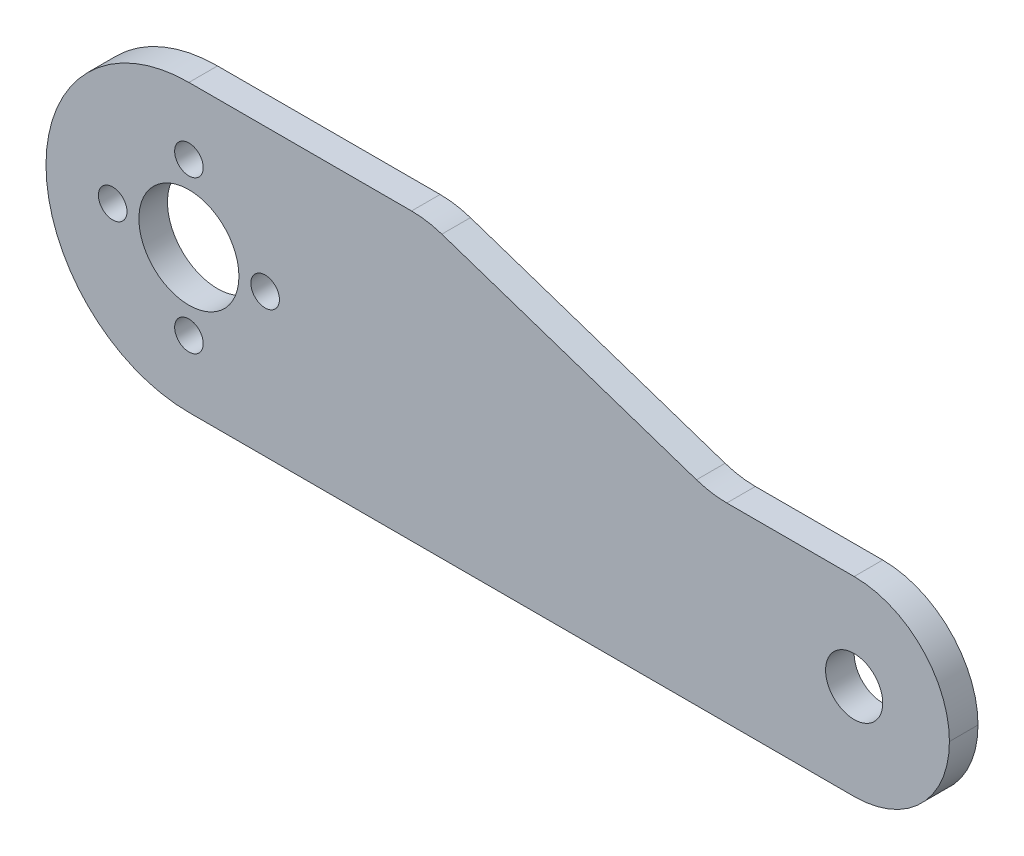
ISO-10303-21;
HEADER;
FILE_DESCRIPTION(('STEP AP214'),'2;1');
FILE_NAME('part.step','',(''),(''),'','','');
FILE_SCHEMA(('AUTOMOTIVE_DESIGN { 1 0 10303 214 1 1 1 1 }'));
ENDSEC;
DATA;
#1=APPLICATION_CONTEXT('core data for automotive mechanical design processes');
#2=APPLICATION_PROTOCOL_DEFINITION('international standard','automotive_design',2000,#1);
#3=PRODUCT_CONTEXT('',#1,'mechanical');
#4=PRODUCT('Part','Part','',(#3));
#5=PRODUCT_RELATED_PRODUCT_CATEGORY('part','',(#4));
#6=PRODUCT_DEFINITION_FORMATION('','',#4);
#7=PRODUCT_DEFINITION_CONTEXT('part definition',#1,'design');
#8=PRODUCT_DEFINITION('design','',#6,#7);
#9=PRODUCT_DEFINITION_SHAPE('','',#8);
#10=(LENGTH_UNIT() NAMED_UNIT(*) SI_UNIT(.MILLI.,.METRE.));
#11=(NAMED_UNIT(*) PLANE_ANGLE_UNIT() SI_UNIT($,.RADIAN.));
#12=(NAMED_UNIT(*) SI_UNIT($,.STERADIAN.) SOLID_ANGLE_UNIT());
#13=UNCERTAINTY_MEASURE_WITH_UNIT(LENGTH_MEASURE(1.E-05),#10,'distance_accuracy_value','');
#14=(GEOMETRIC_REPRESENTATION_CONTEXT(3) GLOBAL_UNCERTAINTY_ASSIGNED_CONTEXT((#13)) GLOBAL_UNIT_ASSIGNED_CONTEXT((#10,
#11,#12)) REPRESENTATION_CONTEXT('',''));
#15=CARTESIAN_POINT('',(0.,0.,0.));
#16=DIRECTION('',(0.,0.,1.));
#17=DIRECTION('',(1.,0.,0.));
#18=AXIS2_PLACEMENT_3D('',#15,#16,#17);
#19=CARTESIAN_POINT('',(0.,0.,3.));
#20=DIRECTION('',(0.,0.,-1.));
#21=DIRECTION('',(-1.,0.,0.));
#22=AXIS2_PLACEMENT_3D('',#19,#20,#21);
#23=PLANE('',#22);
#24=CARTESIAN_POINT('',(15.,15.,3.));
#25=DIRECTION('',(0.,0.,-1.));
#26=DIRECTION('',(-1.,0.,0.));
#27=AXIS2_PLACEMENT_3D('',#24,#25,#26);
#28=CIRCLE('',#27,15.);
#29=CARTESIAN_POINT('',(15.,30.,3.));
#30=VERTEX_POINT('',#29);
#31=CARTESIAN_POINT('',(0.,15.,3.));
#32=VERTEX_POINT('',#31);
#33=EDGE_CURVE('E51',#30,#32,#28,.F.);
#34=ORIENTED_EDGE('',*,*,#33,.T.);
#35=CARTESIAN_POINT('',(15.,15.,3.));
#36=DIRECTION('',(0.,0.,-1.));
#37=DIRECTION('',(-1.,0.,0.));
#38=AXIS2_PLACEMENT_3D('',#35,#36,#37);
#39=CIRCLE('',#38,15.);
#40=CARTESIAN_POINT('',(15.,0.,3.));
#41=VERTEX_POINT('',#40);
#42=EDGE_CURVE('E44',#32,#41,#39,.F.);
#43=ORIENTED_EDGE('',*,*,#42,.T.);
#44=DIRECTION('',(1.,0.,0.));
#45=VECTOR('',#44,1.);
#46=CARTESIAN_POINT('',(0.,0.,3.));
#47=LINE('',#46,#45);
#48=CARTESIAN_POINT('',(84.8212002188447,0.,3.));
#49=VERTEX_POINT('',#48);
#50=EDGE_CURVE('E153',#41,#49,#47,.T.);
#51=ORIENTED_EDGE('',*,*,#50,.T.);
#52=CARTESIAN_POINT('',(84.8212002188447,10.,3.));
#53=DIRECTION('',(0.,0.,-1.));
#54=DIRECTION('',(-1.,0.,0.));
#55=AXIS2_PLACEMENT_3D('',#52,#53,#54);
#56=CIRCLE('',#55,10.);
#57=CARTESIAN_POINT('',(94.8212002188447,10.,3.));
#58=VERTEX_POINT('',#57);
#59=EDGE_CURVE('E158',#49,#58,#56,.F.);
#60=ORIENTED_EDGE('',*,*,#59,.T.);
#61=CARTESIAN_POINT('',(84.8212002188447,10.,3.));
#62=DIRECTION('',(0.,0.,-1.));
#63=DIRECTION('',(-1.,0.,0.));
#64=AXIS2_PLACEMENT_3D('',#61,#62,#63);
#65=CIRCLE('',#64,10.);
#66=CARTESIAN_POINT('',(84.8212002188447,20.,3.));
#67=VERTEX_POINT('',#66);
#68=EDGE_CURVE('E160',#58,#67,#65,.F.);
#69=ORIENTED_EDGE('',*,*,#68,.T.);
#70=DIRECTION('',(-1.,0.,0.));
#71=VECTOR('',#70,1.);
#72=CARTESIAN_POINT('',(94.8212002188447,20.,3.));
#73=LINE('',#72,#71);
#74=CARTESIAN_POINT('',(71.4532030561662,20.,3.));
#75=VERTEX_POINT('',#74);
#76=EDGE_CURVE('E134',#67,#75,#73,.T.);
#77=ORIENTED_EDGE('',*,*,#76,.T.);
#78=CARTESIAN_POINT('',(71.4532030561662,30.,3.));
#79=DIRECTION('',(0.,0.,-1.));
#80=DIRECTION('',(-1.,0.,0.));
#81=AXIS2_PLACEMENT_3D('',#78,#79,#80);
#82=CIRCLE('',#81,10.);
#83=CARTESIAN_POINT('',(68.2738766193188,20.5188669765706,3.));
#84=VERTEX_POINT('',#83);
#85=EDGE_CURVE('E176',#75,#84,#82,.T.);
#86=ORIENTED_EDGE('',*,*,#85,.T.);
#87=DIRECTION('',(-0.948113302342937,0.317932643684744,0.));
#88=VECTOR('',#87,1.);
#89=CARTESIAN_POINT('',(69.8212002188447,20.,3.));
#90=LINE('',#89,#88);
#91=CARTESIAN_POINT('',(41.5473235995259,29.4811330234294,3.));
#92=VERTEX_POINT('',#91);
#93=EDGE_CURVE('E249',#84,#92,#90,.T.);
#94=ORIENTED_EDGE('',*,*,#93,.T.);
#95=CARTESIAN_POINT('',(38.3679971626785,20.,3.));
#96=DIRECTION('',(0.,0.,-1.));
#97=DIRECTION('',(-1.,0.,0.));
#98=AXIS2_PLACEMENT_3D('',#95,#96,#97);
#99=CIRCLE('',#98,10.);
#100=CARTESIAN_POINT('',(38.3679971626785,30.,3.));
#101=VERTEX_POINT('',#100);
#102=EDGE_CURVE('E162',#92,#101,#99,.F.);
#103=ORIENTED_EDGE('',*,*,#102,.T.);
#104=DIRECTION('',(-1.,0.,0.));
#105=VECTOR('',#104,1.);
#106=CARTESIAN_POINT('',(0.,30.,3.));
#107=LINE('',#106,#105);
#108=EDGE_CURVE('E154',#101,#30,#107,.T.);
#109=ORIENTED_EDGE('',*,*,#108,.T.);
#110=EDGE_LOOP('',(#34,#43,#51,#60,#69,#77,#86,#94,#103,#109));
#111=FACE_BOUND('',#110,.T.);
#112=CARTESIAN_POINT('',(15.,15.,3.));
#113=DIRECTION('',(0.,0.,1.));
#114=DIRECTION('',(1.,0.,0.));
#115=AXIS2_PLACEMENT_3D('',#112,#113,#114);
#116=CIRCLE('',#115,5.25);
#117=CARTESIAN_POINT('',(20.25,15.,3.));
#118=VERTEX_POINT('',#117);
#119=EDGE_CURVE('E148',#118,#118,#116,.T.);
#120=ORIENTED_EDGE('',*,*,#119,.F.);
#121=EDGE_LOOP('',(#120));
#122=FACE_BOUND('',#121,.T.);
#123=CARTESIAN_POINT('',(15.,23.,3.));
#124=DIRECTION('',(0.,0.,1.));
#125=DIRECTION('',(1.,0.,0.));
#126=AXIS2_PLACEMENT_3D('',#123,#124,#125);
#127=CIRCLE('',#126,1.5);
#128=CARTESIAN_POINT('',(16.5,23.,3.));
#129=VERTEX_POINT('',#128);
#130=EDGE_CURVE('E258',#129,#129,#127,.T.);
#131=ORIENTED_EDGE('',*,*,#130,.F.);
#132=EDGE_LOOP('',(#131));
#133=FACE_BOUND('',#132,.T.);
#134=CARTESIAN_POINT('',(15.,7.,3.));
#135=DIRECTION('',(0.,0.,1.));
#136=DIRECTION('',(1.,0.,0.));
#137=AXIS2_PLACEMENT_3D('',#134,#135,#136);
#138=CIRCLE('',#137,1.5);
#139=CARTESIAN_POINT('',(16.5,7.,3.));
#140=VERTEX_POINT('',#139);
#141=EDGE_CURVE('E264',#140,#140,#138,.T.);
#142=ORIENTED_EDGE('',*,*,#141,.F.);
#143=EDGE_LOOP('',(#142));
#144=FACE_BOUND('',#143,.T.);
#145=CARTESIAN_POINT('',(23.,15.,3.));
#146=DIRECTION('',(0.,0.,1.));
#147=DIRECTION('',(1.,0.,0.));
#148=AXIS2_PLACEMENT_3D('',#145,#146,#147);
#149=CIRCLE('',#148,1.5);
#150=CARTESIAN_POINT('',(24.5,15.,3.));
#151=VERTEX_POINT('',#150);
#152=EDGE_CURVE('E270',#151,#151,#149,.T.);
#153=ORIENTED_EDGE('',*,*,#152,.F.);
#154=EDGE_LOOP('',(#153));
#155=FACE_BOUND('',#154,.T.);
#156=CARTESIAN_POINT('',(7.,15.,3.));
#157=DIRECTION('',(0.,0.,1.));
#158=DIRECTION('',(1.,0.,0.));
#159=AXIS2_PLACEMENT_3D('',#156,#157,#158);
#160=CIRCLE('',#159,1.5);
#161=CARTESIAN_POINT('',(8.5,15.,3.));
#162=VERTEX_POINT('',#161);
#163=EDGE_CURVE('E276',#162,#162,#160,.T.);
#164=ORIENTED_EDGE('',*,*,#163,.F.);
#165=EDGE_LOOP('',(#164));
#166=FACE_BOUND('',#165,.T.);
#167=CARTESIAN_POINT('',(84.8212002188447,10.,3.));
#168=DIRECTION('',(0.,0.,1.));
#169=DIRECTION('',(1.,0.,0.));
#170=AXIS2_PLACEMENT_3D('',#167,#168,#169);
#171=CIRCLE('',#170,3.00000000000001);
#172=CARTESIAN_POINT('',(87.8212002188447,10.,3.));
#173=VERTEX_POINT('',#172);
#174=EDGE_CURVE('E282',#173,#173,#171,.T.);
#175=ORIENTED_EDGE('',*,*,#174,.F.);
#176=EDGE_LOOP('',(#175));
#177=FACE_BOUND('',#176,.T.);
#178=ADVANCED_FACE('F35',(#111,#122,#133,#144,#155,#166,#177),#23,.F.);
#179=CARTESIAN_POINT('',(0.,0.,0.));
#180=DIRECTION('',(0.,0.,-1.));
#181=DIRECTION('',(-1.,0.,0.));
#182=AXIS2_PLACEMENT_3D('',#179,#180,#181);
#183=PLANE('',#182);
#184=CARTESIAN_POINT('',(7.,15.,0.));
#185=DIRECTION('',(0.,0.,1.));
#186=DIRECTION('',(1.,0.,0.));
#187=AXIS2_PLACEMENT_3D('',#184,#185,#186);
#188=CIRCLE('',#187,1.5);
#189=CARTESIAN_POINT('',(8.5,15.,0.));
#190=VERTEX_POINT('',#189);
#191=EDGE_CURVE('E279',#190,#190,#188,.T.);
#192=ORIENTED_EDGE('',*,*,#191,.T.);
#193=EDGE_LOOP('',(#192));
#194=FACE_BOUND('',#193,.T.);
#195=CARTESIAN_POINT('',(15.,7.,0.));
#196=DIRECTION('',(0.,0.,1.));
#197=DIRECTION('',(1.,0.,0.));
#198=AXIS2_PLACEMENT_3D('',#195,#196,#197);
#199=CIRCLE('',#198,1.5);
#200=CARTESIAN_POINT('',(16.5,7.,0.));
#201=VERTEX_POINT('',#200);
#202=EDGE_CURVE('E267',#201,#201,#199,.T.);
#203=ORIENTED_EDGE('',*,*,#202,.T.);
#204=EDGE_LOOP('',(#203));
#205=FACE_BOUND('',#204,.T.);
#206=CARTESIAN_POINT('',(15.,15.,0.));
#207=DIRECTION('',(0.,0.,1.));
#208=DIRECTION('',(1.,0.,0.));
#209=AXIS2_PLACEMENT_3D('',#206,#207,#208);
#210=CIRCLE('',#209,5.25);
#211=CARTESIAN_POINT('',(20.25,15.,0.));
#212=VERTEX_POINT('',#211);
#213=EDGE_CURVE('E255',#212,#212,#210,.T.);
#214=ORIENTED_EDGE('',*,*,#213,.T.);
#215=EDGE_LOOP('',(#214));
#216=FACE_BOUND('',#215,.T.);
#217=DIRECTION('',(1.,0.,0.));
#218=VECTOR('',#217,1.);
#219=CARTESIAN_POINT('',(0.,0.,0.));
#220=LINE('',#219,#218);
#221=CARTESIAN_POINT('',(15.,0.,0.));
#222=VERTEX_POINT('',#221);
#223=CARTESIAN_POINT('',(84.8212002188447,0.,0.));
#224=VERTEX_POINT('',#223);
#225=EDGE_CURVE('E143',#222,#224,#220,.T.);
#226=ORIENTED_EDGE('',*,*,#225,.F.);
#227=CARTESIAN_POINT('',(15.,15.,0.));
#228=DIRECTION('',(0.,0.,-1.));
#229=DIRECTION('',(-1.,0.,0.));
#230=AXIS2_PLACEMENT_3D('',#227,#228,#229);
#231=CIRCLE('',#230,15.);
#232=CARTESIAN_POINT('',(0.,15.,0.));
#233=VERTEX_POINT('',#232);
#234=EDGE_CURVE('E185',#222,#233,#231,.T.);
#235=ORIENTED_EDGE('',*,*,#234,.T.);
#236=CARTESIAN_POINT('',(15.,15.,0.));
#237=DIRECTION('',(0.,0.,-1.));
#238=DIRECTION('',(-1.,0.,0.));
#239=AXIS2_PLACEMENT_3D('',#236,#237,#238);
#240=CIRCLE('',#239,15.);
#241=CARTESIAN_POINT('',(15.,30.,0.));
#242=VERTEX_POINT('',#241);
#243=EDGE_CURVE('E183',#233,#242,#240,.T.);
#244=ORIENTED_EDGE('',*,*,#243,.T.);
#245=DIRECTION('',(-1.,0.,0.));
#246=VECTOR('',#245,1.);
#247=CARTESIAN_POINT('',(0.,30.,0.));
#248=LINE('',#247,#246);
#249=CARTESIAN_POINT('',(38.3679971626785,30.,0.));
#250=VERTEX_POINT('',#249);
#251=EDGE_CURVE('E146',#250,#242,#248,.T.);
#252=ORIENTED_EDGE('',*,*,#251,.F.);
#253=CARTESIAN_POINT('',(38.3679971626785,20.,0.));
#254=DIRECTION('',(0.,0.,-1.));
#255=DIRECTION('',(-1.,0.,0.));
#256=AXIS2_PLACEMENT_3D('',#253,#254,#255);
#257=CIRCLE('',#256,10.);
#258=CARTESIAN_POINT('',(41.5473235995259,29.4811330234294,0.));
#259=VERTEX_POINT('',#258);
#260=EDGE_CURVE('E124',#250,#259,#257,.T.);
#261=ORIENTED_EDGE('',*,*,#260,.T.);
#262=DIRECTION('',(-0.948113302342937,0.317932643684744,0.));
#263=VECTOR('',#262,1.);
#264=CARTESIAN_POINT('',(69.8212002188447,20.,0.));
#265=LINE('',#264,#263);
#266=CARTESIAN_POINT('',(68.2738766193188,20.5188669765706,0.));
#267=VERTEX_POINT('',#266);
#268=EDGE_CURVE('E142',#267,#259,#265,.T.);
#269=ORIENTED_EDGE('',*,*,#268,.F.);
#270=CARTESIAN_POINT('',(71.4532030561662,30.,0.));
#271=DIRECTION('',(0.,0.,-1.));
#272=DIRECTION('',(-1.,0.,0.));
#273=AXIS2_PLACEMENT_3D('',#270,#271,#272);
#274=CIRCLE('',#273,10.);
#275=CARTESIAN_POINT('',(71.4532030561662,20.,0.));
#276=VERTEX_POINT('',#275);
#277=EDGE_CURVE('E141',#267,#276,#274,.F.);
#278=ORIENTED_EDGE('',*,*,#277,.T.);
#279=DIRECTION('',(-1.,0.,0.));
#280=VECTOR('',#279,1.);
#281=CARTESIAN_POINT('',(94.8212002188447,20.,0.));
#282=LINE('',#281,#280);
#283=CARTESIAN_POINT('',(84.8212002188447,20.,0.));
#284=VERTEX_POINT('',#283);
#285=EDGE_CURVE('E131',#284,#276,#282,.T.);
#286=ORIENTED_EDGE('',*,*,#285,.F.);
#287=CARTESIAN_POINT('',(84.8212002188447,10.,0.));
#288=DIRECTION('',(0.,0.,-1.));
#289=DIRECTION('',(-1.,0.,0.));
#290=AXIS2_PLACEMENT_3D('',#287,#288,#289);
#291=CIRCLE('',#290,10.);
#292=CARTESIAN_POINT('',(94.8212002188447,10.,0.));
#293=VERTEX_POINT('',#292);
#294=EDGE_CURVE('E113',#284,#293,#291,.T.);
#295=ORIENTED_EDGE('',*,*,#294,.T.);
#296=CARTESIAN_POINT('',(84.8212002188447,10.,0.));
#297=DIRECTION('',(0.,0.,-1.));
#298=DIRECTION('',(-1.,0.,0.));
#299=AXIS2_PLACEMENT_3D('',#296,#297,#298);
#300=CIRCLE('',#299,10.);
#301=EDGE_CURVE('E125',#293,#224,#300,.T.);
#302=ORIENTED_EDGE('',*,*,#301,.T.);
#303=EDGE_LOOP('',(#226,#235,#244,#252,#261,#269,#278,#286,#295,#302));
#304=FACE_BOUND('',#303,.T.);
#305=CARTESIAN_POINT('',(15.,23.,0.));
#306=DIRECTION('',(0.,0.,1.));
#307=DIRECTION('',(1.,0.,0.));
#308=AXIS2_PLACEMENT_3D('',#305,#306,#307);
#309=CIRCLE('',#308,1.5);
#310=CARTESIAN_POINT('',(16.5,23.,0.));
#311=VERTEX_POINT('',#310);
#312=EDGE_CURVE('E261',#311,#311,#309,.T.);
#313=ORIENTED_EDGE('',*,*,#312,.T.);
#314=EDGE_LOOP('',(#313));
#315=FACE_BOUND('',#314,.T.);
#316=CARTESIAN_POINT('',(23.,15.,0.));
#317=DIRECTION('',(0.,0.,1.));
#318=DIRECTION('',(1.,0.,0.));
#319=AXIS2_PLACEMENT_3D('',#316,#317,#318);
#320=CIRCLE('',#319,1.5);
#321=CARTESIAN_POINT('',(24.5,15.,0.));
#322=VERTEX_POINT('',#321);
#323=EDGE_CURVE('E273',#322,#322,#320,.T.);
#324=ORIENTED_EDGE('',*,*,#323,.T.);
#325=EDGE_LOOP('',(#324));
#326=FACE_BOUND('',#325,.T.);
#327=CARTESIAN_POINT('',(84.8212002188447,10.,0.));
#328=DIRECTION('',(0.,0.,1.));
#329=DIRECTION('',(1.,0.,0.));
#330=AXIS2_PLACEMENT_3D('',#327,#328,#329);
#331=CIRCLE('',#330,3.00000000000001);
#332=CARTESIAN_POINT('',(87.8212002188447,10.,0.));
#333=VERTEX_POINT('',#332);
#334=EDGE_CURVE('E180',#333,#333,#331,.T.);
#335=ORIENTED_EDGE('',*,*,#334,.T.);
#336=EDGE_LOOP('',(#335));
#337=FACE_BOUND('',#336,.T.);
#338=ADVANCED_FACE('F138',(#194,#205,#216,#304,#315,#326,#337),#183,.T.);
#339=CARTESIAN_POINT('',(0.,0.,3.));
#340=DIRECTION('',(0.,1.,0.));
#341=DIRECTION('',(0.,0.,1.));
#342=AXIS2_PLACEMENT_3D('',#339,#340,#341);
#343=PLANE('',#342);
#344=ORIENTED_EDGE('',*,*,#50,.F.);
#345=DIRECTION('',(0.,0.,-1.));
#346=VECTOR('',#345,1.);
#347=CARTESIAN_POINT('',(15.,0.,3.));
#348=LINE('',#347,#346);
#349=EDGE_CURVE('E178',#41,#222,#348,.T.);
#350=ORIENTED_EDGE('',*,*,#349,.T.);
#351=ORIENTED_EDGE('',*,*,#225,.T.);
#352=DIRECTION('',(0.,0.,-1.));
#353=VECTOR('',#352,1.);
#354=CARTESIAN_POINT('',(84.8212002188447,0.,3.));
#355=LINE('',#354,#353);
#356=EDGE_CURVE('E172',#224,#49,#355,.F.);
#357=ORIENTED_EDGE('',*,*,#356,.T.);
#358=EDGE_LOOP('',(#344,#350,#351,#357));
#359=FACE_BOUND('',#358,.T.);
#360=ADVANCED_FACE('F195',(#359),#343,.F.);
#361=CARTESIAN_POINT('',(94.8212002188447,20.,3.));
#362=DIRECTION('',(0.,-1.,0.));
#363=DIRECTION('',(1.,0.,0.));
#364=AXIS2_PLACEMENT_3D('',#361,#362,#363);
#365=PLANE('',#364);
#366=ORIENTED_EDGE('',*,*,#76,.F.);
#367=DIRECTION('',(0.,0.,-1.));
#368=VECTOR('',#367,1.);
#369=CARTESIAN_POINT('',(84.8212002188447,20.,3.));
#370=LINE('',#369,#368);
#371=EDGE_CURVE('E117',#67,#284,#370,.T.);
#372=ORIENTED_EDGE('',*,*,#371,.T.);
#373=ORIENTED_EDGE('',*,*,#285,.T.);
#374=DIRECTION('',(0.,0.,-1.));
#375=VECTOR('',#374,1.);
#376=CARTESIAN_POINT('',(71.4532030561662,20.,3.));
#377=LINE('',#376,#375);
#378=EDGE_CURVE('E135',#276,#75,#377,.F.);
#379=ORIENTED_EDGE('',*,*,#378,.T.);
#380=EDGE_LOOP('',(#366,#372,#373,#379));
#381=FACE_BOUND('',#380,.T.);
#382=ADVANCED_FACE('F130',(#381),#365,.F.);
#383=CARTESIAN_POINT('',(69.8212002188447,20.,3.));
#384=DIRECTION('',(-0.317932643684744,-0.948113302342937,0.));
#385=DIRECTION('',(0.948113302342937,-0.317932643684744,0.));
#386=AXIS2_PLACEMENT_3D('',#383,#384,#385);
#387=PLANE('',#386);
#388=ORIENTED_EDGE('',*,*,#93,.F.);
#389=DIRECTION('',(0.,0.,-1.));
#390=VECTOR('',#389,1.);
#391=CARTESIAN_POINT('',(68.2738766193188,20.5188669765706,0.));
#392=LINE('',#391,#390);
#393=EDGE_CURVE('E166',#84,#267,#392,.T.);
#394=ORIENTED_EDGE('',*,*,#393,.T.);
#395=ORIENTED_EDGE('',*,*,#268,.T.);
#396=DIRECTION('',(0.,0.,-1.));
#397=VECTOR('',#396,1.);
#398=CARTESIAN_POINT('',(41.5473235995259,29.4811330234294,3.));
#399=LINE('',#398,#397);
#400=EDGE_CURVE('E164',#259,#92,#399,.F.);
#401=ORIENTED_EDGE('',*,*,#400,.T.);
#402=EDGE_LOOP('',(#388,#394,#395,#401));
#403=FACE_BOUND('',#402,.T.);
#404=ADVANCED_FACE('F226',(#403),#387,.F.);
#405=CARTESIAN_POINT('',(0.,30.,3.));
#406=DIRECTION('',(0.,-1.,0.));
#407=DIRECTION('',(0.,0.,-1.));
#408=AXIS2_PLACEMENT_3D('',#405,#406,#407);
#409=PLANE('',#408);
#410=ORIENTED_EDGE('',*,*,#251,.T.);
#411=DIRECTION('',(0.,0.,-1.));
#412=VECTOR('',#411,1.);
#413=CARTESIAN_POINT('',(15.,30.,3.));
#414=LINE('',#413,#412);
#415=EDGE_CURVE('E11',#242,#30,#414,.F.);
#416=ORIENTED_EDGE('',*,*,#415,.T.);
#417=ORIENTED_EDGE('',*,*,#108,.F.);
#418=DIRECTION('',(0.,0.,-1.));
#419=VECTOR('',#418,1.);
#420=CARTESIAN_POINT('',(38.3679971626785,30.,3.));
#421=LINE('',#420,#419);
#422=EDGE_CURVE('E169',#101,#250,#421,.T.);
#423=ORIENTED_EDGE('',*,*,#422,.T.);
#424=EDGE_LOOP('',(#410,#416,#417,#423));
#425=FACE_BOUND('',#424,.T.);
#426=ADVANCED_FACE('F223',(#425),#409,.F.);
#427=CARTESIAN_POINT('',(15.,15.,3.));
#428=DIRECTION('',(0.,0.,-1.));
#429=DIRECTION('',(-1.,0.,0.));
#430=AXIS2_PLACEMENT_3D('',#427,#428,#429);
#431=CYLINDRICAL_SURFACE('',#430,5.25);
#432=ORIENTED_EDGE('',*,*,#119,.T.);
#433=EDGE_LOOP('',(#432));
#434=FACE_BOUND('',#433,.T.);
#435=ORIENTED_EDGE('',*,*,#213,.F.);
#436=EDGE_LOOP('',(#435));
#437=FACE_BOUND('',#436,.T.);
#438=ADVANCED_FACE('F220',(#434,#437),#431,.F.);
#439=CARTESIAN_POINT('',(15.,23.,3.));
#440=DIRECTION('',(0.,0.,-1.));
#441=DIRECTION('',(-1.,0.,0.));
#442=AXIS2_PLACEMENT_3D('',#439,#440,#441);
#443=CYLINDRICAL_SURFACE('',#442,1.5);
#444=ORIENTED_EDGE('',*,*,#130,.T.);
#445=EDGE_LOOP('',(#444));
#446=FACE_BOUND('',#445,.T.);
#447=ORIENTED_EDGE('',*,*,#312,.F.);
#448=EDGE_LOOP('',(#447));
#449=FACE_BOUND('',#448,.T.);
#450=ADVANCED_FACE('F309',(#446,#449),#443,.F.);
#451=CARTESIAN_POINT('',(15.,7.,3.));
#452=DIRECTION('',(0.,0.,-1.));
#453=DIRECTION('',(-1.,0.,0.));
#454=AXIS2_PLACEMENT_3D('',#451,#452,#453);
#455=CYLINDRICAL_SURFACE('',#454,1.5);
#456=ORIENTED_EDGE('',*,*,#141,.T.);
#457=EDGE_LOOP('',(#456));
#458=FACE_BOUND('',#457,.T.);
#459=ORIENTED_EDGE('',*,*,#202,.F.);
#460=EDGE_LOOP('',(#459));
#461=FACE_BOUND('',#460,.T.);
#462=ADVANCED_FACE('F306',(#458,#461),#455,.F.);
#463=CARTESIAN_POINT('',(23.,15.,3.));
#464=DIRECTION('',(0.,0.,-1.));
#465=DIRECTION('',(-1.,0.,0.));
#466=AXIS2_PLACEMENT_3D('',#463,#464,#465);
#467=CYLINDRICAL_SURFACE('',#466,1.5);
#468=ORIENTED_EDGE('',*,*,#152,.T.);
#469=EDGE_LOOP('',(#468));
#470=FACE_BOUND('',#469,.T.);
#471=ORIENTED_EDGE('',*,*,#323,.F.);
#472=EDGE_LOOP('',(#471));
#473=FACE_BOUND('',#472,.T.);
#474=ADVANCED_FACE('F300',(#470,#473),#467,.F.);
#475=CARTESIAN_POINT('',(7.,15.,3.));
#476=DIRECTION('',(0.,0.,-1.));
#477=DIRECTION('',(-1.,0.,0.));
#478=AXIS2_PLACEMENT_3D('',#475,#476,#477);
#479=CYLINDRICAL_SURFACE('',#478,1.5);
#480=ORIENTED_EDGE('',*,*,#163,.T.);
#481=EDGE_LOOP('',(#480));
#482=FACE_BOUND('',#481,.T.);
#483=ORIENTED_EDGE('',*,*,#191,.F.);
#484=EDGE_LOOP('',(#483));
#485=FACE_BOUND('',#484,.T.);
#486=ADVANCED_FACE('F293',(#482,#485),#479,.F.);
#487=CARTESIAN_POINT('',(84.8212002188447,10.,3.));
#488=DIRECTION('',(0.,0.,-1.));
#489=DIRECTION('',(-1.,0.,0.));
#490=AXIS2_PLACEMENT_3D('',#487,#488,#489);
#491=CYLINDRICAL_SURFACE('',#490,3.00000000000001);
#492=ORIENTED_EDGE('',*,*,#174,.T.);
#493=EDGE_LOOP('',(#492));
#494=FACE_BOUND('',#493,.T.);
#495=ORIENTED_EDGE('',*,*,#334,.F.);
#496=EDGE_LOOP('',(#495));
#497=FACE_BOUND('',#496,.T.);
#498=ADVANCED_FACE('F239',(#494,#497),#491,.F.);
#499=CARTESIAN_POINT('',(84.8212002188447,10.,3.));
#500=DIRECTION('',(0.,0.,-1.));
#501=DIRECTION('',(-1.,0.,0.));
#502=AXIS2_PLACEMENT_3D('',#499,#500,#501);
#503=CYLINDRICAL_SURFACE('',#502,10.);
#504=DIRECTION('',(0.,0.,-1.));
#505=VECTOR('',#504,1.);
#506=CARTESIAN_POINT('',(94.8212002188447,10.,3.));
#507=LINE('',#506,#505);
#508=EDGE_CURVE('E119',#58,#293,#507,.T.);
#509=ORIENTED_EDGE('',*,*,#508,.F.);
#510=ORIENTED_EDGE('',*,*,#59,.F.);
#511=ORIENTED_EDGE('',*,*,#356,.F.);
#512=ORIENTED_EDGE('',*,*,#301,.F.);
#513=EDGE_LOOP('',(#509,#510,#511,#512));
#514=FACE_BOUND('',#513,.T.);
#515=ADVANCED_FACE('F236',(#514),#503,.T.);
#516=CARTESIAN_POINT('',(84.8212002188447,10.,3.));
#517=DIRECTION('',(0.,0.,-1.));
#518=DIRECTION('',(-1.,0.,0.));
#519=AXIS2_PLACEMENT_3D('',#516,#517,#518);
#520=CYLINDRICAL_SURFACE('',#519,10.);
#521=ORIENTED_EDGE('',*,*,#68,.F.);
#522=ORIENTED_EDGE('',*,*,#508,.T.);
#523=ORIENTED_EDGE('',*,*,#294,.F.);
#524=ORIENTED_EDGE('',*,*,#371,.F.);
#525=EDGE_LOOP('',(#521,#522,#523,#524));
#526=FACE_BOUND('',#525,.T.);
#527=ADVANCED_FACE('F116',(#526),#520,.T.);
#528=CARTESIAN_POINT('',(71.4532030561662,30.,3.));
#529=DIRECTION('',(0.,0.,1.));
#530=DIRECTION('',(1.,0.,0.));
#531=AXIS2_PLACEMENT_3D('',#528,#529,#530);
#532=CYLINDRICAL_SURFACE('',#531,10.);
#533=ORIENTED_EDGE('',*,*,#85,.F.);
#534=ORIENTED_EDGE('',*,*,#378,.F.);
#535=ORIENTED_EDGE('',*,*,#277,.F.);
#536=ORIENTED_EDGE('',*,*,#393,.F.);
#537=EDGE_LOOP('',(#533,#534,#535,#536));
#538=FACE_BOUND('',#537,.T.);
#539=ADVANCED_FACE('F209',(#538),#532,.F.);
#540=CARTESIAN_POINT('',(38.3679971626785,20.,3.));
#541=DIRECTION('',(0.,0.,-1.));
#542=DIRECTION('',(-1.,0.,0.));
#543=AXIS2_PLACEMENT_3D('',#540,#541,#542);
#544=CYLINDRICAL_SURFACE('',#543,10.);
#545=ORIENTED_EDGE('',*,*,#102,.F.);
#546=ORIENTED_EDGE('',*,*,#400,.F.);
#547=ORIENTED_EDGE('',*,*,#260,.F.);
#548=ORIENTED_EDGE('',*,*,#422,.F.);
#549=EDGE_LOOP('',(#545,#546,#547,#548));
#550=FACE_BOUND('',#549,.T.);
#551=ADVANCED_FACE('F204',(#550),#544,.T.);
#552=CARTESIAN_POINT('',(15.,15.,3.));
#553=DIRECTION('',(0.,0.,-1.));
#554=DIRECTION('',(-1.,0.,0.));
#555=AXIS2_PLACEMENT_3D('',#552,#553,#554);
#556=CYLINDRICAL_SURFACE('',#555,15.);
#557=DIRECTION('',(0.,0.,-1.));
#558=VECTOR('',#557,1.);
#559=CARTESIAN_POINT('',(0.,15.,3.));
#560=LINE('',#559,#558);
#561=EDGE_CURVE('E39',#32,#233,#560,.T.);
#562=ORIENTED_EDGE('',*,*,#561,.F.);
#563=ORIENTED_EDGE('',*,*,#33,.F.);
#564=ORIENTED_EDGE('',*,*,#415,.F.);
#565=ORIENTED_EDGE('',*,*,#243,.F.);
#566=EDGE_LOOP('',(#562,#563,#564,#565));
#567=FACE_BOUND('',#566,.T.);
#568=ADVANCED_FACE('F37',(#567),#556,.T.);
#569=CARTESIAN_POINT('',(15.,15.,3.));
#570=DIRECTION('',(0.,0.,-1.));
#571=DIRECTION('',(-1.,0.,0.));
#572=AXIS2_PLACEMENT_3D('',#569,#570,#571);
#573=CYLINDRICAL_SURFACE('',#572,15.);
#574=ORIENTED_EDGE('',*,*,#42,.F.);
#575=ORIENTED_EDGE('',*,*,#561,.T.);
#576=ORIENTED_EDGE('',*,*,#234,.F.);
#577=ORIENTED_EDGE('',*,*,#349,.F.);
#578=EDGE_LOOP('',(#574,#575,#576,#577));
#579=FACE_BOUND('',#578,.T.);
#580=ADVANCED_FACE('F199',(#579),#573,.T.);
#581=CLOSED_SHELL('',(#178,#338,#360,#382,#404,#426,#438,#450,#462,#474,#486,#498,#515,#527,
#539,#551,#568,#580));
#582=MANIFOLD_SOLID_BREP('B2',#581);
#583=ADVANCED_BREP_SHAPE_REPRESENTATION('',(#18,#582),#14);
#584=SHAPE_DEFINITION_REPRESENTATION(#9,#583);
ENDSEC;
END-ISO-10303-21;
